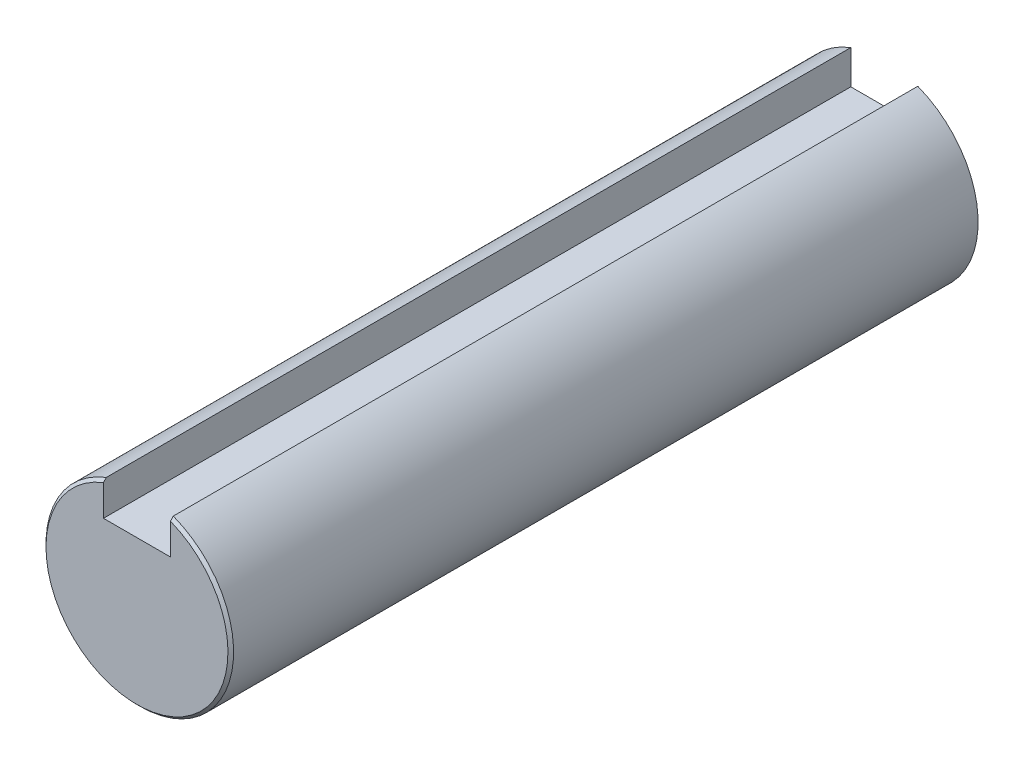
ISO-10303-21;
HEADER;
FILE_DESCRIPTION(('STEP AP214'),'2;1');
FILE_NAME('part.step','',(''),(''),'','','');
FILE_SCHEMA(('AUTOMOTIVE_DESIGN { 1 0 10303 214 1 1 1 1 }'));
ENDSEC;
DATA;
#1=APPLICATION_CONTEXT('core data for automotive mechanical design processes');
#2=APPLICATION_PROTOCOL_DEFINITION('international standard','automotive_design',2000,#1);
#3=PRODUCT_CONTEXT('',#1,'mechanical');
#4=PRODUCT('Part','Part','',(#3));
#5=PRODUCT_RELATED_PRODUCT_CATEGORY('part','',(#4));
#6=PRODUCT_DEFINITION_FORMATION('','',#4);
#7=PRODUCT_DEFINITION_CONTEXT('part definition',#1,'design');
#8=PRODUCT_DEFINITION('design','',#6,#7);
#9=PRODUCT_DEFINITION_SHAPE('','',#8);
#10=(LENGTH_UNIT() NAMED_UNIT(*) SI_UNIT(.MILLI.,.METRE.));
#11=(NAMED_UNIT(*) PLANE_ANGLE_UNIT() SI_UNIT($,.RADIAN.));
#12=(NAMED_UNIT(*) SI_UNIT($,.STERADIAN.) SOLID_ANGLE_UNIT());
#13=UNCERTAINTY_MEASURE_WITH_UNIT(LENGTH_MEASURE(1.E-05),#10,'distance_accuracy_value','');
#14=(GEOMETRIC_REPRESENTATION_CONTEXT(3) GLOBAL_UNCERTAINTY_ASSIGNED_CONTEXT((#13)) GLOBAL_UNIT_ASSIGNED_CONTEXT((#10,
#11,#12)) REPRESENTATION_CONTEXT('',''));
#15=CARTESIAN_POINT('',(0.,0.,0.));
#16=DIRECTION('',(0.,0.,1.));
#17=DIRECTION('',(1.,0.,0.));
#18=AXIS2_PLACEMENT_3D('',#15,#16,#17);
#19=CARTESIAN_POINT('',(0.,0.,99.9999999999999));
#20=DIRECTION('',(0.,0.,-1.));
#21=DIRECTION('',(-1.,0.,0.));
#22=AXIS2_PLACEMENT_3D('',#19,#20,#21);
#23=CYLINDRICAL_SURFACE('',#22,7.);
#24=DIRECTION('',(0.,0.,-1.));
#25=VECTOR('',#24,1.);
#26=CARTESIAN_POINT('',(-2.5,6.53834841531101,99.9999999999999));
#27=LINE('',#26,#25);
#28=CARTESIAN_POINT('',(-2.5,6.53834841531101,99.7899999999999));
#29=VERTEX_POINT('',#28);
#30=CARTESIAN_POINT('',(-2.5,6.53834841531101,44.2274999999999));
#31=VERTEX_POINT('',#30);
#32=EDGE_CURVE('E91',#29,#31,#27,.T.);
#33=ORIENTED_EDGE('',*,*,#32,.T.);
#34=CARTESIAN_POINT('',(0.,0.,44.2274999999999));
#35=DIRECTION('',(0.,0.,1.));
#36=DIRECTION('',(1.,0.,0.));
#37=AXIS2_PLACEMENT_3D('',#34,#35,#36);
#38=CIRCLE('',#37,7.);
#39=CARTESIAN_POINT('',(2.5,6.53834841531101,44.2274999999999));
#40=VERTEX_POINT('',#39);
#41=EDGE_CURVE('E55',#31,#40,#38,.T.);
#42=ORIENTED_EDGE('',*,*,#41,.T.);
#43=DIRECTION('',(0.,0.,-1.));
#44=VECTOR('',#43,1.);
#45=CARTESIAN_POINT('',(2.5,6.53834841531101,99.9999999999999));
#46=LINE('',#45,#44);
#47=CARTESIAN_POINT('',(2.5,6.53834841531101,99.7899999999999));
#48=VERTEX_POINT('',#47);
#49=EDGE_CURVE('E89',#48,#40,#46,.T.);
#50=ORIENTED_EDGE('',*,*,#49,.F.);
#51=CARTESIAN_POINT('',(0.,0.,99.7899999999999));
#52=DIRECTION('',(0.,0.,1.));
#53=DIRECTION('',(1.,0.,0.));
#54=AXIS2_PLACEMENT_3D('',#51,#52,#53);
#55=CIRCLE('',#54,7.);
#56=EDGE_CURVE('E106',#48,#29,#55,.F.);
#57=ORIENTED_EDGE('',*,*,#56,.T.);
#58=EDGE_LOOP('',(#33,#42,#50,#57));
#59=FACE_BOUND('',#58,.T.);
#60=ADVANCED_FACE('F39',(#59),#23,.T.);
#61=CARTESIAN_POINT('',(2.5,4.,99.9999999999999));
#62=DIRECTION('',(1.,0.,0.));
#63=DIRECTION('',(0.,0.,-1.));
#64=AXIS2_PLACEMENT_3D('',#61,#62,#63);
#65=PLANE('',#64);
#66=ORIENTED_EDGE('',*,*,#49,.T.);
#67=DIRECTION('',(0.,-1.,0.));
#68=VECTOR('',#67,1.);
#69=CARTESIAN_POINT('',(2.5,4.,44.2274999999999));
#70=LINE('',#69,#68);
#71=CARTESIAN_POINT('',(2.5,4.,44.2274999999999));
#72=VERTEX_POINT('',#71);
#73=EDGE_CURVE('E93',#40,#72,#70,.T.);
#74=ORIENTED_EDGE('',*,*,#73,.T.);
#75=DIRECTION('',(0.,0.,-1.));
#76=VECTOR('',#75,1.);
#77=CARTESIAN_POINT('',(2.5,4.,99.9999999999999));
#78=LINE('',#77,#76);
#79=CARTESIAN_POINT('',(2.5,4.,99.9999999999999));
#80=VERTEX_POINT('',#79);
#81=EDGE_CURVE('E107',#80,#72,#78,.T.);
#82=ORIENTED_EDGE('',*,*,#81,.F.);
#83=DIRECTION('',(0.,-1.,0.));
#84=VECTOR('',#83,1.);
#85=CARTESIAN_POINT('',(2.5,4.,99.9999999999999));
#86=LINE('',#85,#84);
#87=CARTESIAN_POINT('',(2.5,6.31301037540727,99.9999999999999));
#88=VERTEX_POINT('',#87);
#89=EDGE_CURVE('E92',#88,#80,#86,.T.);
#90=ORIENTED_EDGE('',*,*,#89,.F.);
#91=CARTESIAN_POINT('',(2.5,6.31301037540727,99.9999999999999));
#92=CARTESIAN_POINT('',(2.5,6.350606966243,99.9650431903258));
#93=CARTESIAN_POINT('',(2.5,6.3881834317473,99.9300647854004));
#94=CARTESIAN_POINT('',(2.5,6.46329611171481,99.8600647854));
#95=CARTESIAN_POINT('',(2.5,6.50083232617843,99.8250431903253));
#96=CARTESIAN_POINT('',(2.5,6.53834841531101,99.7899999999999));
#97=B_SPLINE_CURVE_WITH_KNOTS('',3,(#91,#92,#93,#94,#95,#96),.UNSPECIFIED.,.F.,.F.,(4,2,4),(0.,
0.154010766306232,0.308021531061523),.UNSPECIFIED.);
#98=EDGE_CURVE('E105',#88,#48,#97,.T.);
#99=ORIENTED_EDGE('',*,*,#98,.T.);
#100=EDGE_LOOP('',(#66,#74,#82,#90,#99));
#101=FACE_BOUND('',#100,.T.);
#102=ADVANCED_FACE('F103',(#101),#65,.F.);
#103=CARTESIAN_POINT('',(2.5,4.,99.9999999999999));
#104=DIRECTION('',(0.,-1.,0.));
#105=DIRECTION('',(1.,0.,0.));
#106=AXIS2_PLACEMENT_3D('',#103,#104,#105);
#107=PLANE('',#106);
#108=ORIENTED_EDGE('',*,*,#81,.T.);
#109=DIRECTION('',(-1.,0.,0.));
#110=VECTOR('',#109,1.);
#111=CARTESIAN_POINT('',(2.5,4.,44.2274999999999));
#112=LINE('',#111,#110);
#113=CARTESIAN_POINT('',(-2.5,4.,44.2274999999999));
#114=VERTEX_POINT('',#113);
#115=EDGE_CURVE('E98',#72,#114,#112,.T.);
#116=ORIENTED_EDGE('',*,*,#115,.T.);
#117=DIRECTION('',(0.,0.,-1.));
#118=VECTOR('',#117,1.);
#119=CARTESIAN_POINT('',(-2.5,4.,99.9999999999999));
#120=LINE('',#119,#118);
#121=CARTESIAN_POINT('',(-2.5,4.,99.9999999999999));
#122=VERTEX_POINT('',#121);
#123=EDGE_CURVE('E110',#122,#114,#120,.T.);
#124=ORIENTED_EDGE('',*,*,#123,.F.);
#125=DIRECTION('',(-1.,0.,0.));
#126=VECTOR('',#125,1.);
#127=CARTESIAN_POINT('',(2.5,4.,99.9999999999999));
#128=LINE('',#127,#126);
#129=EDGE_CURVE('E189',#80,#122,#128,.T.);
#130=ORIENTED_EDGE('',*,*,#129,.F.);
#131=EDGE_LOOP('',(#108,#116,#124,#130));
#132=FACE_BOUND('',#131,.T.);
#133=ADVANCED_FACE('F128',(#132),#107,.F.);
#134=CARTESIAN_POINT('',(-2.5,4.,99.9999999999999));
#135=DIRECTION('',(-1.,0.,0.));
#136=DIRECTION('',(0.,0.,1.));
#137=AXIS2_PLACEMENT_3D('',#134,#135,#136);
#138=PLANE('',#137);
#139=ORIENTED_EDGE('',*,*,#123,.T.);
#140=DIRECTION('',(0.,1.,0.));
#141=VECTOR('',#140,1.);
#142=CARTESIAN_POINT('',(-2.5,4.,44.2274999999999));
#143=LINE('',#142,#141);
#144=EDGE_CURVE('E11',#114,#31,#143,.T.);
#145=ORIENTED_EDGE('',*,*,#144,.T.);
#146=ORIENTED_EDGE('',*,*,#32,.F.);
#147=CARTESIAN_POINT('',(-2.5,6.53834841531101,99.7899999999999));
#148=CARTESIAN_POINT('',(-2.5,6.50083232617842,99.8250431903253));
#149=CARTESIAN_POINT('',(-2.5,6.4632961117148,99.8600647854));
#150=CARTESIAN_POINT('',(-2.5,6.38818343174729,99.9300647854004));
#151=CARTESIAN_POINT('',(-2.5,6.350606966243,99.9650431903258));
#152=CARTESIAN_POINT('',(-2.5,6.31301037540727,99.9999999999999));
#153=B_SPLINE_CURVE_WITH_KNOTS('',3,(#147,#148,#149,#150,#151,#152),.UNSPECIFIED.,.F.,.F.,(4,2,
4),(0.,0.154010764755291,0.308021531061524),.UNSPECIFIED.);
#154=CARTESIAN_POINT('',(-2.5,6.31301037540727,99.9999999999999));
#155=VERTEX_POINT('',#154);
#156=EDGE_CURVE('E62',#29,#155,#153,.T.);
#157=ORIENTED_EDGE('',*,*,#156,.T.);
#158=DIRECTION('',(0.,1.,0.));
#159=VECTOR('',#158,1.);
#160=CARTESIAN_POINT('',(-2.5,4.,99.9999999999999));
#161=LINE('',#160,#159);
#162=EDGE_CURVE('E186',#122,#155,#161,.T.);
#163=ORIENTED_EDGE('',*,*,#162,.F.);
#164=EDGE_LOOP('',(#139,#145,#146,#157,#163));
#165=FACE_BOUND('',#164,.T.);
#166=ADVANCED_FACE('F148',(#165),#138,.F.);
#167=CARTESIAN_POINT('',(0.,0.,99.9999999999999));
#168=DIRECTION('',(0.,0.,1.));
#169=DIRECTION('',(1.,0.,0.));
#170=AXIS2_PLACEMENT_3D('',#167,#168,#169);
#171=PLANE('',#170);
#172=ORIENTED_EDGE('',*,*,#162,.T.);
#173=CARTESIAN_POINT('',(0.,0.,99.9999999999999));
#174=DIRECTION('',(0.,0.,1.));
#175=DIRECTION('',(1.,0.,0.));
#176=AXIS2_PLACEMENT_3D('',#173,#174,#175);
#177=CIRCLE('',#176,6.78999999999999);
#178=EDGE_CURVE('E48',#155,#88,#177,.T.);
#179=ORIENTED_EDGE('',*,*,#178,.T.);
#180=ORIENTED_EDGE('',*,*,#89,.T.);
#181=ORIENTED_EDGE('',*,*,#129,.T.);
#182=EDGE_LOOP('',(#172,#179,#180,#181));
#183=FACE_BOUND('',#182,.T.);
#184=ADVANCED_FACE('F156',(#183),#171,.T.);
#185=CARTESIAN_POINT('',(0.,0.,99.9999999999999));
#186=DIRECTION('',(0.,0.,-1.));
#187=DIRECTION('',(-1.,0.,0.));
#188=AXIS2_PLACEMENT_3D('',#185,#186,#187);
#189=CONICAL_SURFACE('',#188,6.78999999999999,0.785398163397438);
#190=ORIENTED_EDGE('',*,*,#156,.F.);
#191=ORIENTED_EDGE('',*,*,#56,.F.);
#192=ORIENTED_EDGE('',*,*,#98,.F.);
#193=ORIENTED_EDGE('',*,*,#178,.F.);
#194=EDGE_LOOP('',(#190,#191,#192,#193));
#195=FACE_BOUND('',#194,.T.);
#196=ADVANCED_FACE('F41',(#195),#189,.T.);
#197=CARTESIAN_POINT('',(-29.914606741573,-7.,44.2274999999999));
#198=DIRECTION('',(0.,0.,1.));
#199=DIRECTION('',(1.,0.,0.));
#200=AXIS2_PLACEMENT_3D('',#197,#198,#199);
#201=PLANE('',#200);
#202=ORIENTED_EDGE('',*,*,#144,.F.);
#203=ORIENTED_EDGE('',*,*,#115,.F.);
#204=ORIENTED_EDGE('',*,*,#73,.F.);
#205=ORIENTED_EDGE('',*,*,#41,.F.);
#206=EDGE_LOOP('',(#202,#203,#204,#205));
#207=FACE_BOUND('',#206,.T.);
#208=ADVANCED_FACE('F96',(#207),#201,.F.);
#209=CLOSED_SHELL('',(#60,#102,#133,#166,#184,#196,#208));
#210=MANIFOLD_SOLID_BREP('B2',#209);
#211=ADVANCED_BREP_SHAPE_REPRESENTATION('',(#18,#210),#14);
#212=SHAPE_DEFINITION_REPRESENTATION(#9,#211);
ENDSEC;
END-ISO-10303-21;
